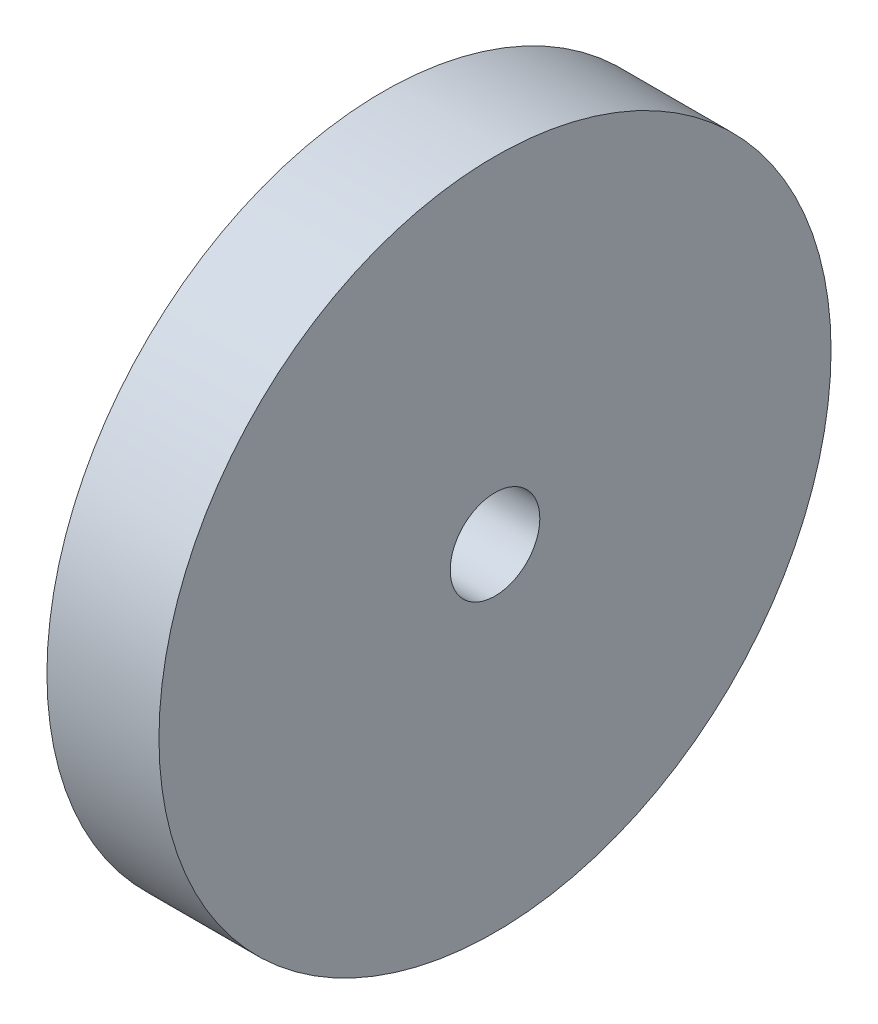
ISO-10303-21;
HEADER;
FILE_DESCRIPTION(('STEP AP214'),'2;1');
FILE_NAME('part.step','',(''),(''),'','','');
FILE_SCHEMA(('AUTOMOTIVE_DESIGN { 1 0 10303 214 1 1 1 1 }'));
ENDSEC;
DATA;
#1=APPLICATION_CONTEXT('core data for automotive mechanical design processes');
#2=APPLICATION_PROTOCOL_DEFINITION('international standard','automotive_design',2000,#1);
#3=PRODUCT_CONTEXT('',#1,'mechanical');
#4=PRODUCT('Part','Part','',(#3));
#5=PRODUCT_RELATED_PRODUCT_CATEGORY('part','',(#4));
#6=PRODUCT_DEFINITION_FORMATION('','',#4);
#7=PRODUCT_DEFINITION_CONTEXT('part definition',#1,'design');
#8=PRODUCT_DEFINITION('design','',#6,#7);
#9=PRODUCT_DEFINITION_SHAPE('','',#8);
#10=(LENGTH_UNIT() NAMED_UNIT(*) SI_UNIT(.MILLI.,.METRE.));
#11=(NAMED_UNIT(*) PLANE_ANGLE_UNIT() SI_UNIT($,.RADIAN.));
#12=(NAMED_UNIT(*) SI_UNIT($,.STERADIAN.) SOLID_ANGLE_UNIT());
#13=UNCERTAINTY_MEASURE_WITH_UNIT(LENGTH_MEASURE(1.E-05),#10,'distance_accuracy_value','');
#14=(GEOMETRIC_REPRESENTATION_CONTEXT(3) GLOBAL_UNCERTAINTY_ASSIGNED_CONTEXT((#13)) GLOBAL_UNIT_ASSIGNED_CONTEXT((#10,
#11,#12)) REPRESENTATION_CONTEXT('',''));
#15=CARTESIAN_POINT('',(0.,0.,0.));
#16=DIRECTION('',(0.,0.,1.));
#17=DIRECTION('',(1.,0.,0.));
#18=AXIS2_PLACEMENT_3D('',#15,#16,#17);
#19=CARTESIAN_POINT('',(5.,0.,0.));
#20=DIRECTION('',(1.,0.,0.));
#21=DIRECTION('',(0.,0.,-1.));
#22=AXIS2_PLACEMENT_3D('',#19,#20,#21);
#23=PLANE('',#22);
#24=CARTESIAN_POINT('',(5.,0.,0.));
#25=DIRECTION('',(1.,0.,0.));
#26=DIRECTION('',(0.,0.,-1.));
#27=AXIS2_PLACEMENT_3D('',#24,#25,#26);
#28=CIRCLE('',#27,15.);
#29=CARTESIAN_POINT('',(5.,0.,-15.));
#30=VERTEX_POINT('',#29);
#31=EDGE_CURVE('E10',#30,#30,#28,.T.);
#32=ORIENTED_EDGE('',*,*,#31,.T.);
#33=EDGE_LOOP('',(#32));
#34=FACE_BOUND('',#33,.T.);
#35=CARTESIAN_POINT('',(5.,0.,0.));
#36=DIRECTION('',(1.,0.,0.));
#37=DIRECTION('',(0.,0.,-1.));
#38=AXIS2_PLACEMENT_3D('',#35,#36,#37);
#39=CIRCLE('',#38,2.);
#40=CARTESIAN_POINT('',(5.,0.,-2.));
#41=VERTEX_POINT('',#40);
#42=EDGE_CURVE('E42',#41,#41,#39,.T.);
#43=ORIENTED_EDGE('',*,*,#42,.F.);
#44=EDGE_LOOP('',(#43));
#45=FACE_BOUND('',#44,.T.);
#46=ADVANCED_FACE('F31',(#34,#45),#23,.T.);
#47=CARTESIAN_POINT('',(0.,0.,0.));
#48=DIRECTION('',(1.,0.,0.));
#49=DIRECTION('',(0.,0.,-1.));
#50=AXIS2_PLACEMENT_3D('',#47,#48,#49);
#51=PLANE('',#50);
#52=CARTESIAN_POINT('',(0.,0.,0.));
#53=DIRECTION('',(1.,0.,0.));
#54=DIRECTION('',(0.,0.,-1.));
#55=AXIS2_PLACEMENT_3D('',#52,#53,#54);
#56=CIRCLE('',#55,15.);
#57=CARTESIAN_POINT('',(0.,0.,-15.));
#58=VERTEX_POINT('',#57);
#59=EDGE_CURVE('E35',#58,#58,#56,.T.);
#60=ORIENTED_EDGE('',*,*,#59,.F.);
#61=EDGE_LOOP('',(#60));
#62=FACE_BOUND('',#61,.T.);
#63=CARTESIAN_POINT('',(0.,0.,0.));
#64=DIRECTION('',(1.,0.,0.));
#65=DIRECTION('',(0.,0.,-1.));
#66=AXIS2_PLACEMENT_3D('',#63,#64,#65);
#67=CIRCLE('',#66,2.);
#68=CARTESIAN_POINT('',(0.,0.,-2.));
#69=VERTEX_POINT('',#68);
#70=EDGE_CURVE('E44',#69,#69,#67,.T.);
#71=ORIENTED_EDGE('',*,*,#70,.T.);
#72=EDGE_LOOP('',(#71));
#73=FACE_BOUND('',#72,.T.);
#74=ADVANCED_FACE('F54',(#62,#73),#51,.F.);
#75=CARTESIAN_POINT('',(5.,0.,0.));
#76=DIRECTION('',(-1.,0.,0.));
#77=DIRECTION('',(0.,0.,1.));
#78=AXIS2_PLACEMENT_3D('',#75,#76,#77);
#79=CYLINDRICAL_SURFACE('',#78,15.);
#80=ORIENTED_EDGE('',*,*,#31,.F.);
#81=EDGE_LOOP('',(#80));
#82=FACE_BOUND('',#81,.T.);
#83=ORIENTED_EDGE('',*,*,#59,.T.);
#84=EDGE_LOOP('',(#83));
#85=FACE_BOUND('',#84,.T.);
#86=ADVANCED_FACE('F33',(#82,#85),#79,.T.);
#87=CARTESIAN_POINT('',(5.,0.,0.));
#88=DIRECTION('',(-1.,0.,0.));
#89=DIRECTION('',(0.,0.,1.));
#90=AXIS2_PLACEMENT_3D('',#87,#88,#89);
#91=CYLINDRICAL_SURFACE('',#90,2.);
#92=ORIENTED_EDGE('',*,*,#42,.T.);
#93=EDGE_LOOP('',(#92));
#94=FACE_BOUND('',#93,.T.);
#95=ORIENTED_EDGE('',*,*,#70,.F.);
#96=EDGE_LOOP('',(#95));
#97=FACE_BOUND('',#96,.T.);
#98=ADVANCED_FACE('F50',(#94,#97),#91,.F.);
#99=CLOSED_SHELL('',(#46,#74,#86,#98));
#100=MANIFOLD_SOLID_BREP('B2',#99);
#101=ADVANCED_BREP_SHAPE_REPRESENTATION('',(#18,#100),#14);
#102=SHAPE_DEFINITION_REPRESENTATION(#9,#101);
ENDSEC;
END-ISO-10303-21;
